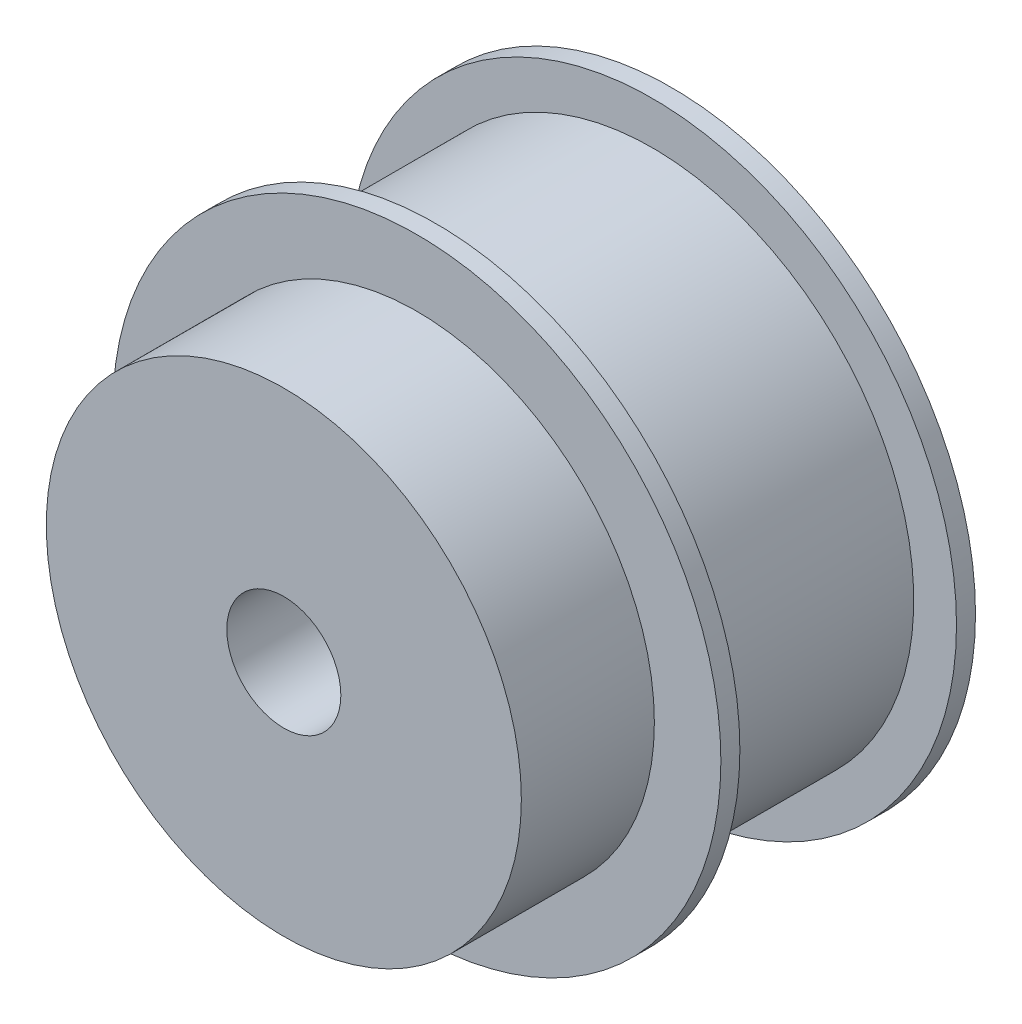
ISO-10303-21;
HEADER;
FILE_DESCRIPTION(('STEP AP214'),'2;1');
FILE_NAME('part.step','',(''),(''),'','','');
FILE_SCHEMA(('AUTOMOTIVE_DESIGN { 1 0 10303 214 1 1 1 1 }'));
ENDSEC;
DATA;
#1=APPLICATION_CONTEXT('core data for automotive mechanical design processes');
#2=APPLICATION_PROTOCOL_DEFINITION('international standard','automotive_design',2000,#1);
#3=PRODUCT_CONTEXT('',#1,'mechanical');
#4=PRODUCT('Part','Part','',(#3));
#5=PRODUCT_RELATED_PRODUCT_CATEGORY('part','',(#4));
#6=PRODUCT_DEFINITION_FORMATION('','',#4);
#7=PRODUCT_DEFINITION_CONTEXT('part definition',#1,'design');
#8=PRODUCT_DEFINITION('design','',#6,#7);
#9=PRODUCT_DEFINITION_SHAPE('','',#8);
#10=(LENGTH_UNIT() NAMED_UNIT(*) SI_UNIT(.MILLI.,.METRE.));
#11=(NAMED_UNIT(*) PLANE_ANGLE_UNIT() SI_UNIT($,.RADIAN.));
#12=(NAMED_UNIT(*) SI_UNIT($,.STERADIAN.) SOLID_ANGLE_UNIT());
#13=UNCERTAINTY_MEASURE_WITH_UNIT(LENGTH_MEASURE(1.E-05),#10,'distance_accuracy_value','');
#14=(GEOMETRIC_REPRESENTATION_CONTEXT(3) GLOBAL_UNCERTAINTY_ASSIGNED_CONTEXT((#13)) GLOBAL_UNIT_ASSIGNED_CONTEXT((#10,
#11,#12)) REPRESENTATION_CONTEXT('',''));
#15=CARTESIAN_POINT('',(0.,0.,0.));
#16=DIRECTION('',(0.,0.,1.));
#17=DIRECTION('',(1.,0.,0.));
#18=AXIS2_PLACEMENT_3D('',#15,#16,#17);
#19=CARTESIAN_POINT('',(0.,0.,11.4));
#20=DIRECTION('',(0.,0.,-1.));
#21=DIRECTION('',(-1.,0.,0.));
#22=AXIS2_PLACEMENT_3D('',#19,#20,#21);
#23=CYLINDRICAL_SURFACE('',#22,13.75);
#24=CARTESIAN_POINT('',(0.,0.,11.4));
#25=DIRECTION('',(0.,0.,1.));
#26=DIRECTION('',(1.,0.,0.));
#27=AXIS2_PLACEMENT_3D('',#24,#25,#26);
#28=CIRCLE('',#27,13.75);
#29=CARTESIAN_POINT('',(13.75,0.,11.4));
#30=VERTEX_POINT('',#29);
#31=EDGE_CURVE('E10',#30,#30,#28,.T.);
#32=ORIENTED_EDGE('',*,*,#31,.F.);
#33=EDGE_LOOP('',(#32));
#34=FACE_BOUND('',#33,.T.);
#35=CARTESIAN_POINT('',(0.,0.,0.));
#36=DIRECTION('',(0.,0.,-1.));
#37=DIRECTION('',(-1.,0.,0.));
#38=AXIS2_PLACEMENT_3D('',#35,#36,#37);
#39=CIRCLE('',#38,13.75);
#40=CARTESIAN_POINT('',(-13.75,0.,0.));
#41=VERTEX_POINT('',#40);
#42=EDGE_CURVE('E46',#41,#41,#39,.T.);
#43=ORIENTED_EDGE('',*,*,#42,.F.);
#44=EDGE_LOOP('',(#43));
#45=FACE_BOUND('',#44,.T.);
#46=ADVANCED_FACE('F31',(#34,#45),#23,.T.);
#47=CARTESIAN_POINT('',(0.,0.,12.4));
#48=DIRECTION('',(0.,0.,-1.));
#49=DIRECTION('',(-1.,0.,0.));
#50=AXIS2_PLACEMENT_3D('',#47,#48,#49);
#51=CYLINDRICAL_SURFACE('',#50,16.);
#52=CARTESIAN_POINT('',(0.,0.,12.4));
#53=DIRECTION('',(0.,0.,1.));
#54=DIRECTION('',(1.,0.,0.));
#55=AXIS2_PLACEMENT_3D('',#52,#53,#54);
#56=CIRCLE('',#55,16.);
#57=CARTESIAN_POINT('',(16.,0.,12.4));
#58=VERTEX_POINT('',#57);
#59=EDGE_CURVE('E38',#58,#58,#56,.T.);
#60=ORIENTED_EDGE('',*,*,#59,.F.);
#61=EDGE_LOOP('',(#60));
#62=FACE_BOUND('',#61,.T.);
#63=CARTESIAN_POINT('',(0.,0.,11.4));
#64=DIRECTION('',(0.,0.,1.));
#65=DIRECTION('',(1.,0.,0.));
#66=AXIS2_PLACEMENT_3D('',#63,#64,#65);
#67=CIRCLE('',#66,16.);
#68=CARTESIAN_POINT('',(16.,0.,11.4));
#69=VERTEX_POINT('',#68);
#70=EDGE_CURVE('E42',#69,#69,#67,.T.);
#71=ORIENTED_EDGE('',*,*,#70,.T.);
#72=EDGE_LOOP('',(#71));
#73=FACE_BOUND('',#72,.T.);
#74=ADVANCED_FACE('F88',(#62,#73),#51,.T.);
#75=CARTESIAN_POINT('',(0.,0.,12.4));
#76=DIRECTION('',(0.,0.,1.));
#77=DIRECTION('',(1.,0.,0.));
#78=AXIS2_PLACEMENT_3D('',#75,#76,#77);
#79=PLANE('',#78);
#80=CARTESIAN_POINT('',(0.,0.,12.4));
#81=DIRECTION('',(0.,0.,1.));
#82=DIRECTION('',(1.,0.,0.));
#83=AXIS2_PLACEMENT_3D('',#80,#81,#82);
#84=CIRCLE('',#83,12.5);
#85=CARTESIAN_POINT('',(12.5,0.,12.4));
#86=VERTEX_POINT('',#85);
#87=EDGE_CURVE('E57',#86,#86,#84,.T.);
#88=ORIENTED_EDGE('',*,*,#87,.F.);
#89=EDGE_LOOP('',(#88));
#90=FACE_BOUND('',#89,.T.);
#91=ORIENTED_EDGE('',*,*,#59,.T.);
#92=EDGE_LOOP('',(#91));
#93=FACE_BOUND('',#92,.T.);
#94=ADVANCED_FACE('F84',(#90,#93),#79,.T.);
#95=CARTESIAN_POINT('',(0.,0.,11.4));
#96=DIRECTION('',(0.,0.,1.));
#97=DIRECTION('',(1.,0.,0.));
#98=AXIS2_PLACEMENT_3D('',#95,#96,#97);
#99=PLANE('',#98);
#100=ORIENTED_EDGE('',*,*,#31,.T.);
#101=EDGE_LOOP('',(#100));
#102=FACE_BOUND('',#101,.T.);
#103=ORIENTED_EDGE('',*,*,#70,.F.);
#104=EDGE_LOOP('',(#103));
#105=FACE_BOUND('',#104,.T.);
#106=ADVANCED_FACE('F87',(#102,#105),#99,.F.);
#107=CARTESIAN_POINT('',(0.,0.,-1.));
#108=DIRECTION('',(0.,0.,1.));
#109=DIRECTION('',(1.,0.,0.));
#110=AXIS2_PLACEMENT_3D('',#107,#108,#109);
#111=CYLINDRICAL_SURFACE('',#110,16.);
#112=CARTESIAN_POINT('',(0.,0.,-1.));
#113=DIRECTION('',(0.,0.,-1.));
#114=DIRECTION('',(-1.,0.,0.));
#115=AXIS2_PLACEMENT_3D('',#112,#113,#114);
#116=CIRCLE('',#115,16.);
#117=CARTESIAN_POINT('',(-16.,0.,-1.));
#118=VERTEX_POINT('',#117);
#119=EDGE_CURVE('E50',#118,#118,#116,.T.);
#120=ORIENTED_EDGE('',*,*,#119,.F.);
#121=EDGE_LOOP('',(#120));
#122=FACE_BOUND('',#121,.T.);
#123=CARTESIAN_POINT('',(0.,0.,0.));
#124=DIRECTION('',(0.,0.,-1.));
#125=DIRECTION('',(-1.,0.,0.));
#126=AXIS2_PLACEMENT_3D('',#123,#124,#125);
#127=CIRCLE('',#126,16.);
#128=CARTESIAN_POINT('',(-16.,0.,0.));
#129=VERTEX_POINT('',#128);
#130=EDGE_CURVE('E51',#129,#129,#127,.T.);
#131=ORIENTED_EDGE('',*,*,#130,.T.);
#132=EDGE_LOOP('',(#131));
#133=FACE_BOUND('',#132,.T.);
#134=ADVANCED_FACE('F97',(#122,#133),#111,.T.);
#135=CARTESIAN_POINT('',(0.,0.,-1.));
#136=DIRECTION('',(0.,0.,-1.));
#137=DIRECTION('',(-1.,0.,0.));
#138=AXIS2_PLACEMENT_3D('',#135,#136,#137);
#139=PLANE('',#138);
#140=CARTESIAN_POINT('',(0.,0.,-1.));
#141=DIRECTION('',(0.,0.,-1.));
#142=DIRECTION('',(-1.,0.,0.));
#143=AXIS2_PLACEMENT_3D('',#140,#141,#142);
#144=CIRCLE('',#143,3.);
#145=CARTESIAN_POINT('',(-3.,0.,-1.));
#146=VERTEX_POINT('',#145);
#147=EDGE_CURVE('E62',#146,#146,#144,.T.);
#148=ORIENTED_EDGE('',*,*,#147,.F.);
#149=EDGE_LOOP('',(#148));
#150=FACE_BOUND('',#149,.T.);
#151=ORIENTED_EDGE('',*,*,#119,.T.);
#152=EDGE_LOOP('',(#151));
#153=FACE_BOUND('',#152,.T.);
#154=ADVANCED_FACE('F102',(#150,#153),#139,.T.);
#155=CARTESIAN_POINT('',(0.,0.,0.));
#156=DIRECTION('',(0.,0.,-1.));
#157=DIRECTION('',(-1.,0.,0.));
#158=AXIS2_PLACEMENT_3D('',#155,#156,#157);
#159=PLANE('',#158);
#160=ORIENTED_EDGE('',*,*,#42,.T.);
#161=EDGE_LOOP('',(#160));
#162=FACE_BOUND('',#161,.T.);
#163=ORIENTED_EDGE('',*,*,#130,.F.);
#164=EDGE_LOOP('',(#163));
#165=FACE_BOUND('',#164,.T.);
#166=ADVANCED_FACE('F80',(#162,#165),#159,.F.);
#167=CARTESIAN_POINT('',(0.,0.,19.4));
#168=DIRECTION('',(0.,0.,-1.));
#169=DIRECTION('',(-1.,0.,0.));
#170=AXIS2_PLACEMENT_3D('',#167,#168,#169);
#171=CYLINDRICAL_SURFACE('',#170,12.5);
#172=CARTESIAN_POINT('',(0.,0.,19.4));
#173=DIRECTION('',(0.,0.,1.));
#174=DIRECTION('',(1.,0.,0.));
#175=AXIS2_PLACEMENT_3D('',#172,#173,#174);
#176=CIRCLE('',#175,12.5);
#177=CARTESIAN_POINT('',(12.5,0.,19.4));
#178=VERTEX_POINT('',#177);
#179=EDGE_CURVE('E54',#178,#178,#176,.T.);
#180=ORIENTED_EDGE('',*,*,#179,.F.);
#181=EDGE_LOOP('',(#180));
#182=FACE_BOUND('',#181,.T.);
#183=ORIENTED_EDGE('',*,*,#87,.T.);
#184=EDGE_LOOP('',(#183));
#185=FACE_BOUND('',#184,.T.);
#186=ADVANCED_FACE('F74',(#182,#185),#171,.T.);
#187=CARTESIAN_POINT('',(0.,0.,19.4));
#188=DIRECTION('',(0.,0.,1.));
#189=DIRECTION('',(1.,0.,0.));
#190=AXIS2_PLACEMENT_3D('',#187,#188,#189);
#191=PLANE('',#190);
#192=CARTESIAN_POINT('',(0.,0.,19.4));
#193=DIRECTION('',(0.,0.,1.));
#194=DIRECTION('',(1.,0.,0.));
#195=AXIS2_PLACEMENT_3D('',#192,#193,#194);
#196=CIRCLE('',#195,3.);
#197=CARTESIAN_POINT('',(3.,0.,19.4));
#198=VERTEX_POINT('',#197);
#199=EDGE_CURVE('E34',#198,#198,#196,.T.);
#200=ORIENTED_EDGE('',*,*,#199,.F.);
#201=EDGE_LOOP('',(#200));
#202=FACE_BOUND('',#201,.T.);
#203=ORIENTED_EDGE('',*,*,#179,.T.);
#204=EDGE_LOOP('',(#203));
#205=FACE_BOUND('',#204,.T.);
#206=ADVANCED_FACE('F71',(#202,#205),#191,.T.);
#207=CARTESIAN_POINT('',(0.,0.,29.));
#208=DIRECTION('',(0.,0.,-1.));
#209=DIRECTION('',(-1.,0.,0.));
#210=AXIS2_PLACEMENT_3D('',#207,#208,#209);
#211=CYLINDRICAL_SURFACE('',#210,3.);
#212=ORIENTED_EDGE('',*,*,#199,.T.);
#213=EDGE_LOOP('',(#212));
#214=FACE_BOUND('',#213,.T.);
#215=ORIENTED_EDGE('',*,*,#147,.T.);
#216=EDGE_LOOP('',(#215));
#217=FACE_BOUND('',#216,.T.);
#218=ADVANCED_FACE('F69',(#214,#217),#211,.F.);
#219=CLOSED_SHELL('',(#46,#74,#94,#106,#134,#154,#166,#186,#206,#218));
#220=MANIFOLD_SOLID_BREP('B2',#219);
#221=ADVANCED_BREP_SHAPE_REPRESENTATION('',(#18,#220),#14);
#222=SHAPE_DEFINITION_REPRESENTATION(#9,#221);
ENDSEC;
END-ISO-10303-21;
